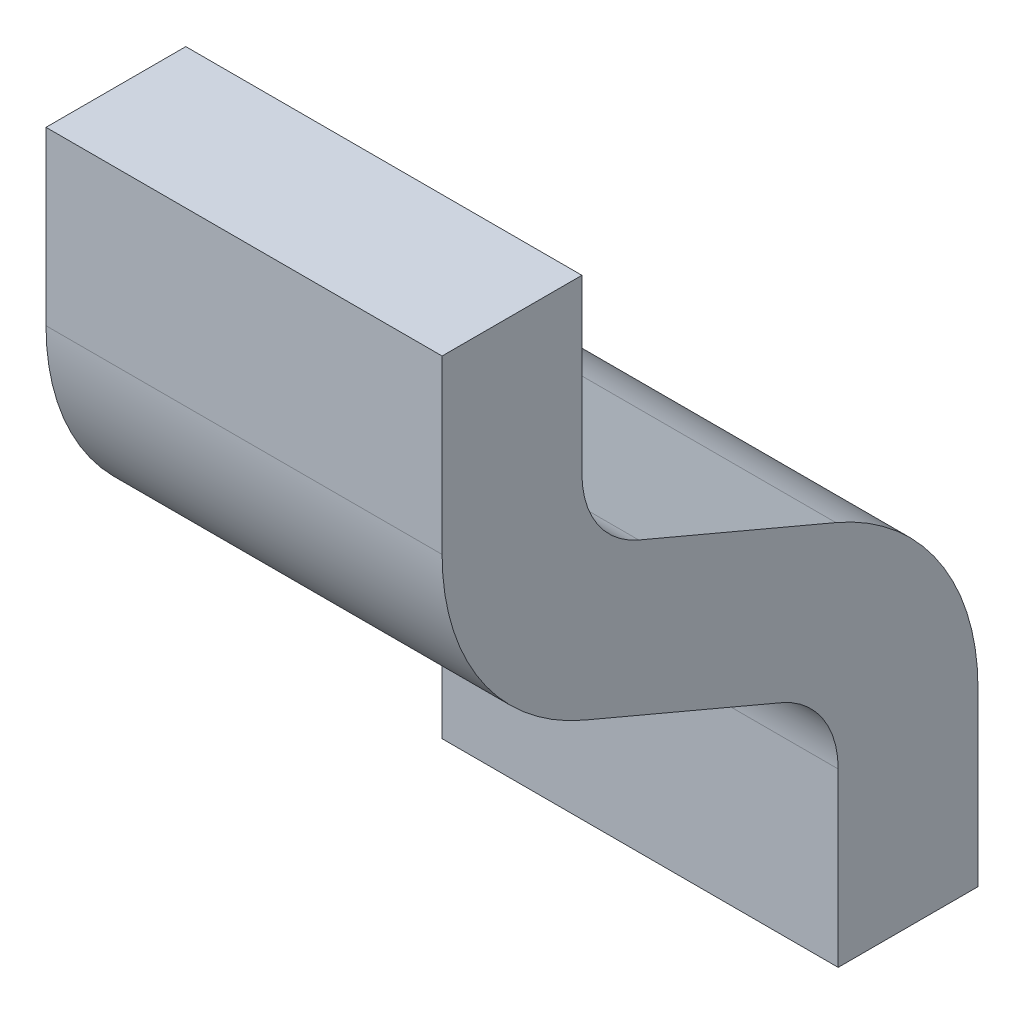
ISO-10303-21;
HEADER;
FILE_DESCRIPTION(('STEP AP214'),'2;1');
FILE_NAME('part.step','',(''),(''),'','','');
FILE_SCHEMA(('AUTOMOTIVE_DESIGN { 1 0 10303 214 1 1 1 1 }'));
ENDSEC;
DATA;
#1=APPLICATION_CONTEXT('core data for automotive mechanical design processes');
#2=APPLICATION_PROTOCOL_DEFINITION('international standard','automotive_design',2000,#1);
#3=PRODUCT_CONTEXT('',#1,'mechanical');
#4=PRODUCT('Part','Part','',(#3));
#5=PRODUCT_RELATED_PRODUCT_CATEGORY('part','',(#4));
#6=PRODUCT_DEFINITION_FORMATION('','',#4);
#7=PRODUCT_DEFINITION_CONTEXT('part definition',#1,'design');
#8=PRODUCT_DEFINITION('design','',#6,#7);
#9=PRODUCT_DEFINITION_SHAPE('','',#8);
#10=(LENGTH_UNIT() NAMED_UNIT(*) SI_UNIT(.MILLI.,.METRE.));
#11=(NAMED_UNIT(*) PLANE_ANGLE_UNIT() SI_UNIT($,.RADIAN.));
#12=(NAMED_UNIT(*) SI_UNIT($,.STERADIAN.) SOLID_ANGLE_UNIT());
#13=UNCERTAINTY_MEASURE_WITH_UNIT(LENGTH_MEASURE(1.E-05),#10,'distance_accuracy_value','');
#14=(GEOMETRIC_REPRESENTATION_CONTEXT(3) GLOBAL_UNCERTAINTY_ASSIGNED_CONTEXT((#13)) GLOBAL_UNIT_ASSIGNED_CONTEXT((#10,
#11,#12)) REPRESENTATION_CONTEXT('',''));
#15=CARTESIAN_POINT('',(0.,0.,0.));
#16=DIRECTION('',(0.,0.,1.));
#17=DIRECTION('',(1.,0.,0.));
#18=AXIS2_PLACEMENT_3D('',#15,#16,#17);
#19=CARTESIAN_POINT('',(0.2125,-0.859684643653,0.2875));
#20=DIRECTION('',(1.,0.,0.));
#21=DIRECTION('',(0.,1.,0.));
#22=AXIS2_PLACEMENT_3D('',#19,#20,#21);
#23=PLANE('',#22);
#24=DIRECTION('',(0.,1.,0.));
#25=VECTOR('',#24,1.);
#26=CARTESIAN_POINT('',(0.2125,-0.9,0.));
#27=LINE('',#26,#25);
#28=CARTESIAN_POINT('',(0.2125,-1.065615478845,0.));
#29=VERTEX_POINT('',#28);
#30=CARTESIAN_POINT('',(0.2125,-1.25,0.));
#31=VERTEX_POINT('',#30);
#32=EDGE_CURVE('E130',#29,#31,#27,.F.);
#33=ORIENTED_EDGE('',*,*,#32,.F.);
#34=CARTESIAN_POINT('',(0.2125,-1.065615478845,0.25));
#35=DIRECTION('',(1.,0.,0.));
#36=DIRECTION('',(0.,1.,0.));
#37=AXIS2_PLACEMENT_3D('',#34,#35,#36);
#38=CIRCLE('',#37,0.25);
#39=CARTESIAN_POINT('',(0.2125,-0.835411062150514,0.152501658811934));
#40=VERTEX_POINT('',#39);
#41=EDGE_CURVE('E173',#40,#29,#38,.F.);
#42=ORIENTED_EDGE('',*,*,#41,.F.);
#43=DIRECTION('',(0.,0.389993364752999,0.920817666776998));
#44=VECTOR('',#43,1.);
#45=CARTESIAN_POINT('',(0.2125,-0.72,0.425));
#46=LINE('',#45,#44);
#47=CARTESIAN_POINT('',(0.2125,-0.745835575139861,0.363999336475155));
#48=VERTEX_POINT('',#47);
#49=EDGE_CURVE('E90',#48,#40,#46,.F.);
#50=ORIENTED_EDGE('',*,*,#49,.F.);
#51=CARTESIAN_POINT('',(0.2125,-0.653753808462,0.325));
#52=DIRECTION('',(1.,0.,0.));
#53=DIRECTION('',(0.,1.,0.));
#54=AXIS2_PLACEMENT_3D('',#51,#52,#53);
#55=CIRCLE('',#54,0.1);
#56=CARTESIAN_POINT('',(0.2125,-0.653753808462,0.425));
#57=VERTEX_POINT('',#56);
#58=EDGE_CURVE('E20',#48,#57,#55,.F.);
#59=ORIENTED_EDGE('',*,*,#58,.T.);
#60=DIRECTION('',(0.,1.,0.));
#61=VECTOR('',#60,1.);
#62=CARTESIAN_POINT('',(0.2125,-0.469369287307,0.425));
#63=LINE('',#62,#61);
#64=CARTESIAN_POINT('',(0.2125,-0.469369287307,0.425));
#65=VERTEX_POINT('',#64);
#66=EDGE_CURVE('E96',#65,#57,#63,.F.);
#67=ORIENTED_EDGE('',*,*,#66,.F.);
#68=DIRECTION('',(0.,0.,1.));
#69=VECTOR('',#68,1.);
#70=CARTESIAN_POINT('',(0.2125,-0.469369287307,0.575));
#71=LINE('',#70,#69);
#72=CARTESIAN_POINT('',(0.2125,-0.469369287307,0.575));
#73=VERTEX_POINT('',#72);
#74=EDGE_CURVE('E102',#73,#65,#71,.F.);
#75=ORIENTED_EDGE('',*,*,#74,.F.);
#76=DIRECTION('',(0.,-1.,0.));
#77=VECTOR('',#76,1.);
#78=CARTESIAN_POINT('',(0.2125,-0.819369287307,0.575));
#79=LINE('',#78,#77);
#80=CARTESIAN_POINT('',(0.2125,-0.653753808462,0.575));
#81=VERTEX_POINT('',#80);
#82=EDGE_CURVE('E108',#81,#73,#79,.F.);
#83=ORIENTED_EDGE('',*,*,#82,.F.);
#84=CARTESIAN_POINT('',(0.2125,-0.653753808462,0.325));
#85=DIRECTION('',(1.,0.,0.));
#86=DIRECTION('',(0.,1.,0.));
#87=AXIS2_PLACEMENT_3D('',#84,#85,#86);
#88=CIRCLE('',#87,0.25);
#89=CARTESIAN_POINT('',(0.2125,-0.883958225156545,0.422498341188303));
#90=VERTEX_POINT('',#89);
#91=EDGE_CURVE('E196',#90,#81,#88,.F.);
#92=ORIENTED_EDGE('',*,*,#91,.F.);
#93=DIRECTION('',(0.,-0.389993364752999,-0.920817666776998));
#94=VECTOR('',#93,1.);
#95=CARTESIAN_POINT('',(0.2125,-0.999369287307,0.15));
#96=LINE('',#95,#94);
#97=CARTESIAN_POINT('',(0.2125,-0.973533712167139,0.211000663524845));
#98=VERTEX_POINT('',#97);
#99=EDGE_CURVE('E193',#98,#90,#96,.F.);
#100=ORIENTED_EDGE('',*,*,#99,.F.);
#101=CARTESIAN_POINT('',(0.2125,-1.065615478845,0.25));
#102=DIRECTION('',(1.,0.,0.));
#103=DIRECTION('',(0.,1.,0.));
#104=AXIS2_PLACEMENT_3D('',#101,#102,#103);
#105=CIRCLE('',#104,0.1);
#106=CARTESIAN_POINT('',(0.2125,-1.065615478845,0.15));
#107=VERTEX_POINT('',#106);
#108=EDGE_CURVE('E190',#98,#107,#105,.F.);
#109=ORIENTED_EDGE('',*,*,#108,.T.);
#110=DIRECTION('',(0.,-1.,0.));
#111=VECTOR('',#110,1.);
#112=CARTESIAN_POINT('',(0.2125,-1.25,0.15));
#113=LINE('',#112,#111);
#114=CARTESIAN_POINT('',(0.2125,-1.25,0.15));
#115=VERTEX_POINT('',#114);
#116=EDGE_CURVE('E186',#115,#107,#113,.F.);
#117=ORIENTED_EDGE('',*,*,#116,.F.);
#118=DIRECTION('',(0.,0.,1.));
#119=VECTOR('',#118,1.);
#120=CARTESIAN_POINT('',(0.2125,-1.25,0.));
#121=LINE('',#120,#119);
#122=EDGE_CURVE('E126',#31,#115,#121,.T.);
#123=ORIENTED_EDGE('',*,*,#122,.F.);
#124=EDGE_LOOP('',(#33,#42,#50,#59,#67,#75,#83,#92,#100,#109,#117,#123));
#125=FACE_BOUND('',#124,.T.);
#126=ADVANCED_FACE('F17',(#125),#23,.T.);
#127=CARTESIAN_POINT('',(-0.2125,-0.72,0.425));
#128=DIRECTION('',(0.,0.920817666776998,-0.389993364752999));
#129=DIRECTION('',(0.,0.389993364752999,0.920817666776998));
#130=AXIS2_PLACEMENT_3D('',#127,#128,#129);
#131=PLANE('',#130);
#132=ORIENTED_EDGE('',*,*,#49,.T.);
#133=DIRECTION('',(1.,0.,0.));
#134=VECTOR('',#133,1.);
#135=CARTESIAN_POINT('',(-0.2125,-0.835411062150547,0.152501658812231));
#136=LINE('',#135,#134);
#137=CARTESIAN_POINT('',(-0.2125,-0.835411062150317,0.152501658812014));
#138=VERTEX_POINT('',#137);
#139=EDGE_CURVE('E174',#138,#40,#136,.T.);
#140=ORIENTED_EDGE('',*,*,#139,.F.);
#141=DIRECTION('',(0.,0.389993364751889,0.920817666777468));
#142=VECTOR('',#141,1.);
#143=CARTESIAN_POINT('',(-0.2125,-0.83541106215,0.152501658812));
#144=LINE('',#143,#142);
#145=CARTESIAN_POINT('',(-0.2125,-0.745835575139874,0.363999336475094));
#146=VERTEX_POINT('',#145);
#147=EDGE_CURVE('E169',#138,#146,#144,.T.);
#148=ORIENTED_EDGE('',*,*,#147,.T.);
#149=DIRECTION('',(1.,0.,0.));
#150=VECTOR('',#149,1.);
#151=CARTESIAN_POINT('',(-0.2125,-0.745835575139853,0.363999336474938));
#152=LINE('',#151,#150);
#153=EDGE_CURVE('E211',#146,#48,#152,.T.);
#154=ORIENTED_EDGE('',*,*,#153,.T.);
#155=EDGE_LOOP('',(#132,#140,#148,#154));
#156=FACE_BOUND('',#155,.T.);
#157=ADVANCED_FACE('F258',(#156),#131,.T.);
#158=CARTESIAN_POINT('',(-0.2125,-0.653753808462,0.325));
#159=DIRECTION('',(1.,0.,0.));
#160=DIRECTION('',(0.,1.,0.));
#161=AXIS2_PLACEMENT_3D('',#158,#159,#160);
#162=CYLINDRICAL_SURFACE('',#161,0.1);
#163=ORIENTED_EDGE('',*,*,#58,.F.);
#164=ORIENTED_EDGE('',*,*,#153,.F.);
#165=CARTESIAN_POINT('',(-0.2125,-0.653753808462,0.325));
#166=DIRECTION('',(1.,0.,0.));
#167=DIRECTION('',(0.,1.,0.));
#168=AXIS2_PLACEMENT_3D('',#165,#166,#167);
#169=CIRCLE('',#168,0.1);
#170=CARTESIAN_POINT('',(-0.2125,-0.653753808462,0.425));
#171=VERTEX_POINT('',#170);
#172=EDGE_CURVE('E166',#146,#171,#169,.F.);
#173=ORIENTED_EDGE('',*,*,#172,.T.);
#174=DIRECTION('',(1.,0.,0.));
#175=VECTOR('',#174,1.);
#176=CARTESIAN_POINT('',(-0.2125,-0.653753808462,0.425));
#177=LINE('',#176,#175);
#178=EDGE_CURVE('E209',#57,#171,#177,.F.);
#179=ORIENTED_EDGE('',*,*,#178,.F.);
#180=EDGE_LOOP('',(#163,#164,#173,#179));
#181=FACE_BOUND('',#180,.T.);
#182=ADVANCED_FACE('F256',(#181),#162,.F.);
#183=CARTESIAN_POINT('',(-0.2125,-0.469369287307,0.425));
#184=DIRECTION('',(0.,0.,-1.));
#185=DIRECTION('',(0.,1.,0.));
#186=AXIS2_PLACEMENT_3D('',#183,#184,#185);
#187=PLANE('',#186);
#188=ORIENTED_EDGE('',*,*,#66,.T.);
#189=ORIENTED_EDGE('',*,*,#178,.T.);
#190=DIRECTION('',(0.,1.,0.));
#191=VECTOR('',#190,1.);
#192=CARTESIAN_POINT('',(-0.2125,-0.859684643653,0.425));
#193=LINE('',#192,#191);
#194=CARTESIAN_POINT('',(-0.2125,-0.469369287307,0.425));
#195=VERTEX_POINT('',#194);
#196=EDGE_CURVE('E163',#171,#195,#193,.T.);
#197=ORIENTED_EDGE('',*,*,#196,.T.);
#198=DIRECTION('',(-1.,0.,0.));
#199=VECTOR('',#198,1.);
#200=CARTESIAN_POINT('',(-0.2125,-0.469369287307,0.425));
#201=LINE('',#200,#199);
#202=EDGE_CURVE('E205',#65,#195,#201,.T.);
#203=ORIENTED_EDGE('',*,*,#202,.F.);
#204=EDGE_LOOP('',(#188,#189,#197,#203));
#205=FACE_BOUND('',#204,.T.);
#206=ADVANCED_FACE('F252',(#205),#187,.T.);
#207=CARTESIAN_POINT('',(-0.2125,-0.469369287307,0.575));
#208=DIRECTION('',(0.,1.,0.));
#209=DIRECTION('',(-1.,0.,0.));
#210=AXIS2_PLACEMENT_3D('',#207,#208,#209);
#211=PLANE('',#210);
#212=ORIENTED_EDGE('',*,*,#202,.T.);
#213=DIRECTION('',(0.,0.,1.));
#214=VECTOR('',#213,1.);
#215=CARTESIAN_POINT('',(-0.2125,-0.469369287307,0.2875));
#216=LINE('',#215,#214);
#217=CARTESIAN_POINT('',(-0.2125,-0.469369287307,0.575));
#218=VERTEX_POINT('',#217);
#219=EDGE_CURVE('E160',#195,#218,#216,.T.);
#220=ORIENTED_EDGE('',*,*,#219,.T.);
#221=DIRECTION('',(1.,0.,0.));
#222=VECTOR('',#221,1.);
#223=CARTESIAN_POINT('',(-0.2125,-0.469369287307,0.575));
#224=LINE('',#223,#222);
#225=EDGE_CURVE('E197',#73,#218,#224,.F.);
#226=ORIENTED_EDGE('',*,*,#225,.F.);
#227=ORIENTED_EDGE('',*,*,#74,.T.);
#228=EDGE_LOOP('',(#212,#220,#226,#227));
#229=FACE_BOUND('',#228,.T.);
#230=ADVANCED_FACE('F251',(#229),#211,.T.);
#231=CARTESIAN_POINT('',(-0.2125,-0.819369287307,0.575));
#232=DIRECTION('',(0.,0.,1.));
#233=DIRECTION('',(0.,-1.,0.));
#234=AXIS2_PLACEMENT_3D('',#231,#232,#233);
#235=PLANE('',#234);
#236=ORIENTED_EDGE('',*,*,#82,.T.);
#237=ORIENTED_EDGE('',*,*,#225,.T.);
#238=DIRECTION('',(0.,1.,0.));
#239=VECTOR('',#238,1.);
#240=CARTESIAN_POINT('',(-0.2125,-0.859684643653,0.575));
#241=LINE('',#240,#239);
#242=CARTESIAN_POINT('',(-0.2125,-0.653753808462,0.575));
#243=VERTEX_POINT('',#242);
#244=EDGE_CURVE('E157',#218,#243,#241,.F.);
#245=ORIENTED_EDGE('',*,*,#244,.T.);
#246=DIRECTION('',(1.,0.,0.));
#247=VECTOR('',#246,1.);
#248=CARTESIAN_POINT('',(-0.2125,-0.653753808462,0.575));
#249=LINE('',#248,#247);
#250=EDGE_CURVE('E194',#81,#243,#249,.F.);
#251=ORIENTED_EDGE('',*,*,#250,.F.);
#252=EDGE_LOOP('',(#236,#237,#245,#251));
#253=FACE_BOUND('',#252,.T.);
#254=ADVANCED_FACE('F246',(#253),#235,.T.);
#255=CARTESIAN_POINT('',(-0.2125,-0.653753808462,0.325));
#256=DIRECTION('',(1.,0.,0.));
#257=DIRECTION('',(0.,1.,0.));
#258=AXIS2_PLACEMENT_3D('',#255,#256,#257);
#259=CYLINDRICAL_SURFACE('',#258,0.25);
#260=ORIENTED_EDGE('',*,*,#91,.T.);
#261=ORIENTED_EDGE('',*,*,#250,.T.);
#262=CARTESIAN_POINT('',(-0.2125,-0.653753808462,0.325));
#263=DIRECTION('',(1.,0.,0.));
#264=DIRECTION('',(0.,1.,0.));
#265=AXIS2_PLACEMENT_3D('',#262,#263,#264);
#266=CIRCLE('',#265,0.25);
#267=CARTESIAN_POINT('',(-0.2125,-0.883958225156123,0.422498341188505));
#268=VERTEX_POINT('',#267);
#269=EDGE_CURVE('E156',#243,#268,#266,.T.);
#270=ORIENTED_EDGE('',*,*,#269,.T.);
#271=DIRECTION('',(1.,0.,0.));
#272=VECTOR('',#271,1.);
#273=CARTESIAN_POINT('',(-0.2125,-0.883958225156571,0.422498341188242));
#274=LINE('',#273,#272);
#275=EDGE_CURVE('E191',#90,#268,#274,.F.);
#276=ORIENTED_EDGE('',*,*,#275,.F.);
#277=EDGE_LOOP('',(#260,#261,#270,#276));
#278=FACE_BOUND('',#277,.T.);
#279=ADVANCED_FACE('F243',(#278),#259,.T.);
#280=CARTESIAN_POINT('',(-0.2125,-0.999369287307,0.15));
#281=DIRECTION('',(0.,-0.920817666776998,0.389993364752999));
#282=DIRECTION('',(0.,-0.389993364752999,-0.920817666776998));
#283=AXIS2_PLACEMENT_3D('',#280,#281,#282);
#284=PLANE('',#283);
#285=ORIENTED_EDGE('',*,*,#99,.T.);
#286=ORIENTED_EDGE('',*,*,#275,.T.);
#287=DIRECTION('',(0.,-0.38999336475558,-0.920817666775905));
#288=VECTOR('',#287,1.);
#289=CARTESIAN_POINT('',(-0.2125,-0.883958225156,0.422498341188));
#290=LINE('',#289,#288);
#291=CARTESIAN_POINT('',(-0.2125,-0.973533712167205,0.211000663524721));
#292=VERTEX_POINT('',#291);
#293=EDGE_CURVE('E146',#268,#292,#290,.T.);
#294=ORIENTED_EDGE('',*,*,#293,.T.);
#295=DIRECTION('',(1.,0.,0.));
#296=VECTOR('',#295,1.);
#297=CARTESIAN_POINT('',(-0.2125,-0.973533712167147,0.211000663525062));
#298=LINE('',#297,#296);
#299=EDGE_CURVE('E187',#292,#98,#298,.T.);
#300=ORIENTED_EDGE('',*,*,#299,.T.);
#301=EDGE_LOOP('',(#285,#286,#294,#300));
#302=FACE_BOUND('',#301,.T.);
#303=ADVANCED_FACE('F266',(#302),#284,.T.);
#304=CARTESIAN_POINT('',(-0.2125,-1.065615478845,0.25));
#305=DIRECTION('',(1.,0.,0.));
#306=DIRECTION('',(0.,1.,0.));
#307=AXIS2_PLACEMENT_3D('',#304,#305,#306);
#308=CYLINDRICAL_SURFACE('',#307,0.1);
#309=ORIENTED_EDGE('',*,*,#108,.F.);
#310=ORIENTED_EDGE('',*,*,#299,.F.);
#311=CARTESIAN_POINT('',(-0.2125,-1.065615478845,0.25));
#312=DIRECTION('',(1.,0.,0.));
#313=DIRECTION('',(0.,1.,0.));
#314=AXIS2_PLACEMENT_3D('',#311,#312,#313);
#315=CIRCLE('',#314,0.1);
#316=CARTESIAN_POINT('',(-0.2125,-1.065615478845,0.15));
#317=VERTEX_POINT('',#316);
#318=EDGE_CURVE('E144',#292,#317,#315,.F.);
#319=ORIENTED_EDGE('',*,*,#318,.T.);
#320=DIRECTION('',(1.,0.,0.));
#321=VECTOR('',#320,1.);
#322=CARTESIAN_POINT('',(-0.2125,-1.065615478845,0.15));
#323=LINE('',#322,#321);
#324=EDGE_CURVE('E143',#107,#317,#323,.F.);
#325=ORIENTED_EDGE('',*,*,#324,.F.);
#326=EDGE_LOOP('',(#309,#310,#319,#325));
#327=FACE_BOUND('',#326,.T.);
#328=ADVANCED_FACE('F264',(#327),#308,.F.);
#329=CARTESIAN_POINT('',(-0.2125,-1.25,0.15));
#330=DIRECTION('',(0.,0.,1.));
#331=DIRECTION('',(0.,-1.,0.));
#332=AXIS2_PLACEMENT_3D('',#329,#330,#331);
#333=PLANE('',#332);
#334=ORIENTED_EDGE('',*,*,#116,.T.);
#335=ORIENTED_EDGE('',*,*,#324,.T.);
#336=DIRECTION('',(0.,1.,0.));
#337=VECTOR('',#336,1.);
#338=CARTESIAN_POINT('',(-0.2125,-0.859684643653,0.15));
#339=LINE('',#338,#337);
#340=CARTESIAN_POINT('',(-0.2125,-1.25,0.15));
#341=VERTEX_POINT('',#340);
#342=EDGE_CURVE('E137',#317,#341,#339,.F.);
#343=ORIENTED_EDGE('',*,*,#342,.T.);
#344=DIRECTION('',(1.,0.,0.));
#345=VECTOR('',#344,1.);
#346=CARTESIAN_POINT('',(-0.2125,-1.25,0.15));
#347=LINE('',#346,#345);
#348=EDGE_CURVE('E120',#115,#341,#347,.F.);
#349=ORIENTED_EDGE('',*,*,#348,.F.);
#350=EDGE_LOOP('',(#334,#335,#343,#349));
#351=FACE_BOUND('',#350,.T.);
#352=ADVANCED_FACE('F141',(#351),#333,.T.);
#353=CARTESIAN_POINT('',(-0.2125,-1.25,0.));
#354=DIRECTION('',(0.,-1.,0.));
#355=DIRECTION('',(1.,0.,0.));
#356=AXIS2_PLACEMENT_3D('',#353,#354,#355);
#357=PLANE('',#356);
#358=ORIENTED_EDGE('',*,*,#348,.T.);
#359=DIRECTION('',(0.,0.,1.));
#360=VECTOR('',#359,1.);
#361=CARTESIAN_POINT('',(-0.2125,-1.25,0.2875));
#362=LINE('',#361,#360);
#363=CARTESIAN_POINT('',(-0.2125,-1.25,0.));
#364=VERTEX_POINT('',#363);
#365=EDGE_CURVE('E124',#341,#364,#362,.F.);
#366=ORIENTED_EDGE('',*,*,#365,.T.);
#367=DIRECTION('',(1.,0.,0.));
#368=VECTOR('',#367,1.);
#369=CARTESIAN_POINT('',(-0.2125,-1.25,0.));
#370=LINE('',#369,#368);
#371=EDGE_CURVE('E177',#31,#364,#370,.F.);
#372=ORIENTED_EDGE('',*,*,#371,.F.);
#373=ORIENTED_EDGE('',*,*,#122,.T.);
#374=EDGE_LOOP('',(#358,#366,#372,#373));
#375=FACE_BOUND('',#374,.T.);
#376=ADVANCED_FACE('F122',(#375),#357,.T.);
#377=CARTESIAN_POINT('',(-0.2125,-0.9,0.));
#378=DIRECTION('',(0.,0.,-1.));
#379=DIRECTION('',(0.,1.,0.));
#380=AXIS2_PLACEMENT_3D('',#377,#378,#379);
#381=PLANE('',#380);
#382=ORIENTED_EDGE('',*,*,#32,.T.);
#383=ORIENTED_EDGE('',*,*,#371,.T.);
#384=DIRECTION('',(0.,1.,0.));
#385=VECTOR('',#384,1.);
#386=CARTESIAN_POINT('',(-0.2125,-0.859684643653,0.));
#387=LINE('',#386,#385);
#388=CARTESIAN_POINT('',(-0.2125,-1.065615478845,0.));
#389=VERTEX_POINT('',#388);
#390=EDGE_CURVE('E26',#364,#389,#387,.T.);
#391=ORIENTED_EDGE('',*,*,#390,.T.);
#392=DIRECTION('',(1.,0.,0.));
#393=VECTOR('',#392,1.);
#394=CARTESIAN_POINT('',(-0.2125,-1.065615478845,0.));
#395=LINE('',#394,#393);
#396=EDGE_CURVE('E34',#29,#389,#395,.F.);
#397=ORIENTED_EDGE('',*,*,#396,.F.);
#398=EDGE_LOOP('',(#382,#383,#391,#397));
#399=FACE_BOUND('',#398,.T.);
#400=ADVANCED_FACE('F261',(#399),#381,.T.);
#401=CARTESIAN_POINT('',(-0.2125,-1.065615478845,0.25));
#402=DIRECTION('',(1.,0.,0.));
#403=DIRECTION('',(0.,1.,0.));
#404=AXIS2_PLACEMENT_3D('',#401,#402,#403);
#405=CYLINDRICAL_SURFACE('',#404,0.25);
#406=ORIENTED_EDGE('',*,*,#396,.T.);
#407=CARTESIAN_POINT('',(-0.2125,-1.065615478845,0.25));
#408=DIRECTION('',(1.,0.,0.));
#409=DIRECTION('',(0.,1.,0.));
#410=AXIS2_PLACEMENT_3D('',#407,#408,#409);
#411=CIRCLE('',#410,0.25);
#412=EDGE_CURVE('E11',#389,#138,#411,.T.);
#413=ORIENTED_EDGE('',*,*,#412,.T.);
#414=ORIENTED_EDGE('',*,*,#139,.T.);
#415=ORIENTED_EDGE('',*,*,#41,.T.);
#416=EDGE_LOOP('',(#406,#413,#414,#415));
#417=FACE_BOUND('',#416,.T.);
#418=ADVANCED_FACE('F277',(#417),#405,.T.);
#419=CARTESIAN_POINT('',(-0.2125,-0.859684643653,0.2875));
#420=DIRECTION('',(1.,0.,0.));
#421=DIRECTION('',(0.,1.,0.));
#422=AXIS2_PLACEMENT_3D('',#419,#420,#421);
#423=PLANE('',#422);
#424=ORIENTED_EDGE('',*,*,#390,.F.);
#425=ORIENTED_EDGE('',*,*,#365,.F.);
#426=ORIENTED_EDGE('',*,*,#342,.F.);
#427=ORIENTED_EDGE('',*,*,#318,.F.);
#428=ORIENTED_EDGE('',*,*,#293,.F.);
#429=ORIENTED_EDGE('',*,*,#269,.F.);
#430=ORIENTED_EDGE('',*,*,#244,.F.);
#431=ORIENTED_EDGE('',*,*,#219,.F.);
#432=ORIENTED_EDGE('',*,*,#196,.F.);
#433=ORIENTED_EDGE('',*,*,#172,.F.);
#434=ORIENTED_EDGE('',*,*,#147,.F.);
#435=ORIENTED_EDGE('',*,*,#412,.F.);
#436=EDGE_LOOP('',(#424,#425,#426,#427,#428,#429,#430,#431,#432,#433,#434,#435));
#437=FACE_BOUND('',#436,.T.);
#438=ADVANCED_FACE('F135',(#437),#423,.F.);
#439=CLOSED_SHELL('',(#126,#157,#182,#206,#230,#254,#279,#303,#328,#352,#376,#400,#418,#438));
#440=MANIFOLD_SOLID_BREP('B1',#439);
#441=ADVANCED_BREP_SHAPE_REPRESENTATION('',(#18,#440),#14);
#442=SHAPE_DEFINITION_REPRESENTATION(#9,#441);
ENDSEC;
END-ISO-10303-21;
